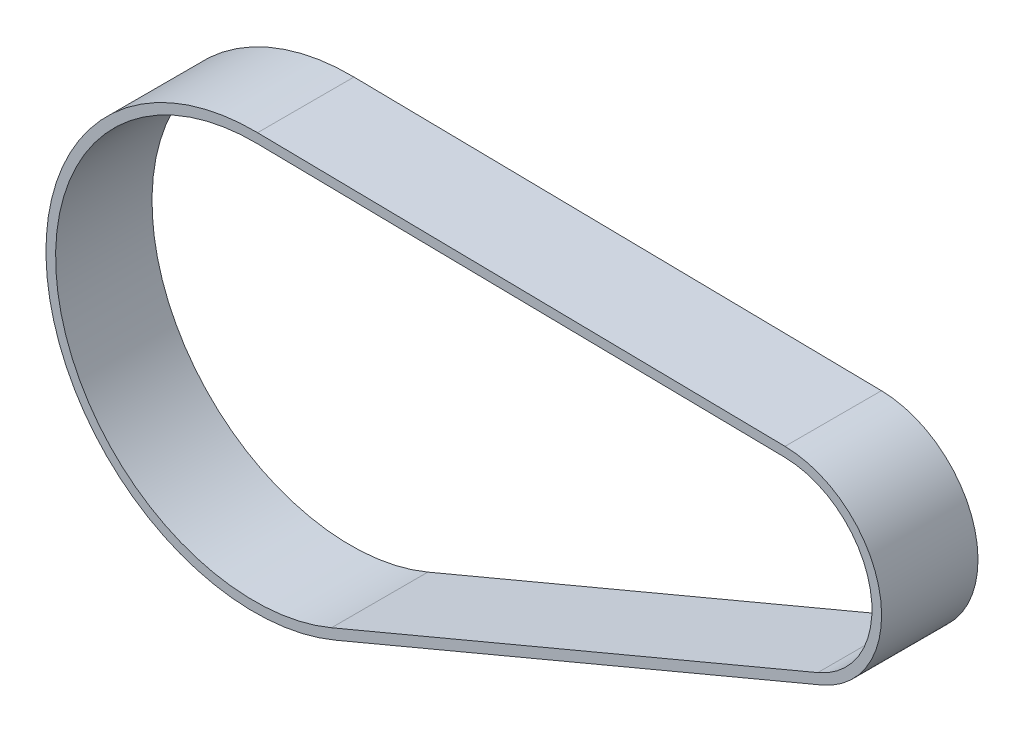
ISO-10303-21;
HEADER;
FILE_DESCRIPTION(('STEP AP214'),'2;1');
FILE_NAME('part.step','',(''),(''),'','','');
FILE_SCHEMA(('AUTOMOTIVE_DESIGN { 1 0 10303 214 1 1 1 1 }'));
ENDSEC;
DATA;
#1=APPLICATION_CONTEXT('core data for automotive mechanical design processes');
#2=APPLICATION_PROTOCOL_DEFINITION('international standard','automotive_design',2000,#1);
#3=PRODUCT_CONTEXT('',#1,'mechanical');
#4=PRODUCT('Part','Part','',(#3));
#5=PRODUCT_RELATED_PRODUCT_CATEGORY('part','',(#4));
#6=PRODUCT_DEFINITION_FORMATION('','',#4);
#7=PRODUCT_DEFINITION_CONTEXT('part definition',#1,'design');
#8=PRODUCT_DEFINITION('design','',#6,#7);
#9=PRODUCT_DEFINITION_SHAPE('','',#8);
#10=(LENGTH_UNIT() NAMED_UNIT(*) SI_UNIT(.MILLI.,.METRE.));
#11=(NAMED_UNIT(*) PLANE_ANGLE_UNIT() SI_UNIT($,.RADIAN.));
#12=(NAMED_UNIT(*) SI_UNIT($,.STERADIAN.) SOLID_ANGLE_UNIT());
#13=UNCERTAINTY_MEASURE_WITH_UNIT(LENGTH_MEASURE(1.E-05),#10,'distance_accuracy_value','');
#14=(GEOMETRIC_REPRESENTATION_CONTEXT(3) GLOBAL_UNCERTAINTY_ASSIGNED_CONTEXT((#13)) GLOBAL_UNIT_ASSIGNED_CONTEXT((#10,
#11,#12)) REPRESENTATION_CONTEXT('',''));
#15=CARTESIAN_POINT('',(0.,0.,0.));
#16=DIRECTION('',(0.,0.,1.));
#17=DIRECTION('',(1.,0.,0.));
#18=AXIS2_PLACEMENT_3D('',#15,#16,#17);
#19=CARTESIAN_POINT('',(-26.1794774684558,56.2138626438231,10.));
#20=DIRECTION('',(0.,0.,1.));
#21=DIRECTION('',(1.,0.,0.));
#22=AXIS2_PLACEMENT_3D('',#19,#20,#21);
#23=PLANE('',#22);
#24=CARTESIAN_POINT('',(-26.1794774684558,56.2138626438231,10.));
#25=DIRECTION('',(0.,0.,1.));
#26=DIRECTION('',(1.,0.,0.));
#27=AXIS2_PLACEMENT_3D('',#24,#25,#26);
#28=CIRCLE('',#27,21.625);
#29=CARTESIAN_POINT('',(-25.8550015384656,77.8364281801062,10.));
#30=VERTEX_POINT('',#29);
#31=CARTESIAN_POINT('',(-17.8029891496812,36.2770858620705,10.));
#32=VERTEX_POINT('',#31);
#33=EDGE_CURVE('E134',#30,#32,#28,.T.);
#34=ORIENTED_EDGE('',*,*,#33,.T.);
#35=DIRECTION('',(0.921931874300702,0.387352060983797,0.));
#36=VECTOR('',#35,1.);
#37=CARTESIAN_POINT('',(-17.8029891496812,36.2770858620705,10.));
#38=LINE('',#37,#36);
#39=CARTESIAN_POINT('',(32.6393486030413,57.4705645062256,10.));
#40=VERTEX_POINT('',#39);
#41=EDGE_CURVE('E137',#32,#40,#38,.T.);
#42=ORIENTED_EDGE('',*,*,#41,.T.);
#43=CARTESIAN_POINT('',(28.6999781428361,66.8466116678637,10.));
#44=DIRECTION('',(0.,0.,1.));
#45=DIRECTION('',(1.,0.,0.));
#46=AXIS2_PLACEMENT_3D('',#43,#44,#45);
#47=CIRCLE('',#46,10.17);
#48=CARTESIAN_POINT('',(28.8525756091021,77.0154667663146,10.));
#49=VERTEX_POINT('',#48);
#50=EDGE_CURVE('E140',#40,#49,#47,.T.);
#51=ORIENTED_EDGE('',*,*,#50,.T.);
#52=DIRECTION('',(-0.999887423643148,0.0150046672827857,0.));
#53=VECTOR('',#52,1.);
#54=CARTESIAN_POINT('',(-25.8550015384656,77.8364281801062,10.));
#55=LINE('',#54,#53);
#56=EDGE_CURVE('E142',#49,#30,#55,.T.);
#57=ORIENTED_EDGE('',*,*,#56,.T.);
#58=EDGE_LOOP('',(#34,#42,#51,#57));
#59=FACE_BOUND('',#58,.T.);
#60=DIRECTION('',(0.921931874300702,0.387352060983797,0.));
#61=VECTOR('',#60,1.);
#62=CARTESIAN_POINT('',(-18.190341210665,37.1990177363711,10.));
#63=LINE('',#62,#61);
#64=CARTESIAN_POINT('',(-18.190341210665,37.1990177363711,10.));
#65=VERTEX_POINT('',#64);
#66=CARTESIAN_POINT('',(32.2519965420575,58.3924963805263,10.));
#67=VERTEX_POINT('',#66);
#68=EDGE_CURVE('E106',#65,#67,#63,.T.);
#69=ORIENTED_EDGE('',*,*,#68,.F.);
#70=CARTESIAN_POINT('',(-26.1794774684558,56.2138626438231,10.));
#71=DIRECTION('',(0.,0.,1.));
#72=DIRECTION('',(1.,0.,0.));
#73=AXIS2_PLACEMENT_3D('',#70,#71,#72);
#74=CIRCLE('',#73,20.625);
#75=CARTESIAN_POINT('',(-25.8700062057483,76.8365407564631,10.));
#76=VERTEX_POINT('',#75);
#77=EDGE_CURVE('E98',#76,#65,#74,.T.);
#78=ORIENTED_EDGE('',*,*,#77,.F.);
#79=DIRECTION('',(-0.999887423643148,0.0150046672827857,0.));
#80=VECTOR('',#79,1.);
#81=CARTESIAN_POINT('',(-25.8700062057483,76.8365407564631,10.));
#82=LINE('',#81,#80);
#83=CARTESIAN_POINT('',(28.8375709418193,76.0155793426714,10.));
#84=VERTEX_POINT('',#83);
#85=EDGE_CURVE('E120',#84,#76,#82,.T.);
#86=ORIENTED_EDGE('',*,*,#85,.F.);
#87=CARTESIAN_POINT('',(28.6999781428361,66.8466116678637,10.));
#88=DIRECTION('',(0.,0.,1.));
#89=DIRECTION('',(1.,0.,0.));
#90=AXIS2_PLACEMENT_3D('',#87,#88,#89);
#91=CIRCLE('',#90,9.16999999999999);
#92=EDGE_CURVE('E118',#67,#84,#91,.T.);
#93=ORIENTED_EDGE('',*,*,#92,.F.);
#94=EDGE_LOOP('',(#69,#78,#86,#93));
#95=FACE_BOUND('',#94,.T.);
#96=ADVANCED_FACE('F33',(#59,#95),#23,.T.);
#97=CARTESIAN_POINT('',(-26.1794774684558,56.2138626438231,0.));
#98=DIRECTION('',(0.,0.,1.));
#99=DIRECTION('',(1.,0.,0.));
#100=AXIS2_PLACEMENT_3D('',#97,#98,#99);
#101=PLANE('',#100);
#102=CARTESIAN_POINT('',(-26.1794774684558,56.2138626438231,0.));
#103=DIRECTION('',(0.,0.,1.));
#104=DIRECTION('',(1.,0.,0.));
#105=AXIS2_PLACEMENT_3D('',#102,#103,#104);
#106=CIRCLE('',#105,21.625);
#107=CARTESIAN_POINT('',(-25.8550015384656,77.8364281801062,0.));
#108=VERTEX_POINT('',#107);
#109=CARTESIAN_POINT('',(-17.8029891496812,36.2770858620705,0.));
#110=VERTEX_POINT('',#109);
#111=EDGE_CURVE('E114',#108,#110,#106,.T.);
#112=ORIENTED_EDGE('',*,*,#111,.F.);
#113=DIRECTION('',(-0.999887423643148,0.0150046672827857,0.));
#114=VECTOR('',#113,1.);
#115=CARTESIAN_POINT('',(-25.8550015384656,77.8364281801062,0.));
#116=LINE('',#115,#114);
#117=CARTESIAN_POINT('',(28.8525756091021,77.0154667663146,0.));
#118=VERTEX_POINT('',#117);
#119=EDGE_CURVE('E138',#118,#108,#116,.T.);
#120=ORIENTED_EDGE('',*,*,#119,.F.);
#121=CARTESIAN_POINT('',(28.6999781428361,66.8466116678637,0.));
#122=DIRECTION('',(0.,0.,1.));
#123=DIRECTION('',(1.,0.,0.));
#124=AXIS2_PLACEMENT_3D('',#121,#122,#123);
#125=CIRCLE('',#124,10.17);
#126=CARTESIAN_POINT('',(32.6393486030413,57.4705645062256,0.));
#127=VERTEX_POINT('',#126);
#128=EDGE_CURVE('E149',#127,#118,#125,.T.);
#129=ORIENTED_EDGE('',*,*,#128,.F.);
#130=DIRECTION('',(0.921931874300702,0.387352060983797,0.));
#131=VECTOR('',#130,1.);
#132=CARTESIAN_POINT('',(-17.8029891496812,36.2770858620705,0.));
#133=LINE('',#132,#131);
#134=EDGE_CURVE('E147',#110,#127,#133,.T.);
#135=ORIENTED_EDGE('',*,*,#134,.F.);
#136=EDGE_LOOP('',(#112,#120,#129,#135));
#137=FACE_BOUND('',#136,.T.);
#138=CARTESIAN_POINT('',(-26.1794774684558,56.2138626438231,0.));
#139=DIRECTION('',(0.,0.,1.));
#140=DIRECTION('',(1.,0.,0.));
#141=AXIS2_PLACEMENT_3D('',#138,#139,#140);
#142=CIRCLE('',#141,20.625);
#143=CARTESIAN_POINT('',(-25.8700062057483,76.8365407564631,0.));
#144=VERTEX_POINT('',#143);
#145=CARTESIAN_POINT('',(-18.190341210665,37.1990177363711,0.));
#146=VERTEX_POINT('',#145);
#147=EDGE_CURVE('E56',#144,#146,#142,.T.);
#148=ORIENTED_EDGE('',*,*,#147,.T.);
#149=DIRECTION('',(0.921931874300702,0.387352060983797,0.));
#150=VECTOR('',#149,1.);
#151=CARTESIAN_POINT('',(-18.190341210665,37.1990177363711,0.));
#152=LINE('',#151,#150);
#153=CARTESIAN_POINT('',(32.2519965420575,58.3924963805263,0.));
#154=VERTEX_POINT('',#153);
#155=EDGE_CURVE('E113',#146,#154,#152,.T.);
#156=ORIENTED_EDGE('',*,*,#155,.T.);
#157=CARTESIAN_POINT('',(28.6999781428361,66.8466116678637,0.));
#158=DIRECTION('',(0.,0.,1.));
#159=DIRECTION('',(1.,0.,0.));
#160=AXIS2_PLACEMENT_3D('',#157,#158,#159);
#161=CIRCLE('',#160,9.16999999999999);
#162=CARTESIAN_POINT('',(28.8375709418193,76.0155793426714,0.));
#163=VERTEX_POINT('',#162);
#164=EDGE_CURVE('E126',#154,#163,#161,.T.);
#165=ORIENTED_EDGE('',*,*,#164,.T.);
#166=DIRECTION('',(-0.999887423643148,0.0150046672827857,0.));
#167=VECTOR('',#166,1.);
#168=CARTESIAN_POINT('',(-25.8700062057483,76.8365407564631,0.));
#169=LINE('',#168,#167);
#170=EDGE_CURVE('E107',#163,#144,#169,.T.);
#171=ORIENTED_EDGE('',*,*,#170,.T.);
#172=EDGE_LOOP('',(#148,#156,#165,#171));
#173=FACE_BOUND('',#172,.T.);
#174=ADVANCED_FACE('F167',(#137,#173),#101,.F.);
#175=CARTESIAN_POINT('',(-26.1794774684558,56.2138626438231,10.));
#176=DIRECTION('',(0.,0.,-1.));
#177=DIRECTION('',(-1.,0.,0.));
#178=AXIS2_PLACEMENT_3D('',#175,#176,#177);
#179=CYLINDRICAL_SURFACE('',#178,21.625);
#180=ORIENTED_EDGE('',*,*,#111,.T.);
#181=DIRECTION('',(0.,0.,-1.));
#182=VECTOR('',#181,1.);
#183=CARTESIAN_POINT('',(-17.8029891496812,36.2770858620705,10.));
#184=LINE('',#183,#182);
#185=EDGE_CURVE('E11',#32,#110,#184,.T.);
#186=ORIENTED_EDGE('',*,*,#185,.F.);
#187=ORIENTED_EDGE('',*,*,#33,.F.);
#188=DIRECTION('',(0.,0.,-1.));
#189=VECTOR('',#188,1.);
#190=CARTESIAN_POINT('',(-25.8550015384656,77.8364281801062,10.));
#191=LINE('',#190,#189);
#192=EDGE_CURVE('E144',#30,#108,#191,.T.);
#193=ORIENTED_EDGE('',*,*,#192,.T.);
#194=EDGE_LOOP('',(#180,#186,#187,#193));
#195=FACE_BOUND('',#194,.T.);
#196=ADVANCED_FACE('F35',(#195),#179,.T.);
#197=CARTESIAN_POINT('',(-17.8029891496812,36.2770858620705,10.));
#198=DIRECTION('',(-0.387352060983797,0.921931874300702,0.));
#199=DIRECTION('',(-0.921931874300702,-0.387352060983797,0.));
#200=AXIS2_PLACEMENT_3D('',#197,#198,#199);
#201=PLANE('',#200);
#202=ORIENTED_EDGE('',*,*,#134,.T.);
#203=DIRECTION('',(0.,0.,-1.));
#204=VECTOR('',#203,1.);
#205=CARTESIAN_POINT('',(32.6393486030413,57.4705645062256,10.));
#206=LINE('',#205,#204);
#207=EDGE_CURVE('E41',#40,#127,#206,.T.);
#208=ORIENTED_EDGE('',*,*,#207,.F.);
#209=ORIENTED_EDGE('',*,*,#41,.F.);
#210=ORIENTED_EDGE('',*,*,#185,.T.);
#211=EDGE_LOOP('',(#202,#208,#209,#210));
#212=FACE_BOUND('',#211,.T.);
#213=ADVANCED_FACE('F177',(#212),#201,.F.);
#214=CARTESIAN_POINT('',(28.6999781428361,66.8466116678637,10.));
#215=DIRECTION('',(0.,0.,-1.));
#216=DIRECTION('',(-1.,0.,0.));
#217=AXIS2_PLACEMENT_3D('',#214,#215,#216);
#218=CYLINDRICAL_SURFACE('',#217,10.17);
#219=ORIENTED_EDGE('',*,*,#128,.T.);
#220=DIRECTION('',(0.,0.,-1.));
#221=VECTOR('',#220,1.);
#222=CARTESIAN_POINT('',(28.8525756091021,77.0154667663146,10.));
#223=LINE('',#222,#221);
#224=EDGE_CURVE('E154',#49,#118,#223,.T.);
#225=ORIENTED_EDGE('',*,*,#224,.F.);
#226=ORIENTED_EDGE('',*,*,#50,.F.);
#227=ORIENTED_EDGE('',*,*,#207,.T.);
#228=EDGE_LOOP('',(#219,#225,#226,#227));
#229=FACE_BOUND('',#228,.T.);
#230=ADVANCED_FACE('F161',(#229),#218,.T.);
#231=CARTESIAN_POINT('',(-25.8550015384656,77.8364281801062,10.));
#232=DIRECTION('',(-0.0150046672827857,-0.999887423643148,0.));
#233=DIRECTION('',(0.999887423643148,-0.0150046672827857,0.));
#234=AXIS2_PLACEMENT_3D('',#231,#232,#233);
#235=PLANE('',#234);
#236=ORIENTED_EDGE('',*,*,#119,.T.);
#237=ORIENTED_EDGE('',*,*,#192,.F.);
#238=ORIENTED_EDGE('',*,*,#56,.F.);
#239=ORIENTED_EDGE('',*,*,#224,.T.);
#240=EDGE_LOOP('',(#236,#237,#238,#239));
#241=FACE_BOUND('',#240,.T.);
#242=ADVANCED_FACE('F171',(#241),#235,.F.);
#243=CARTESIAN_POINT('',(-26.1794774684558,56.2138626438231,10.));
#244=DIRECTION('',(0.,0.,-1.));
#245=DIRECTION('',(-1.,0.,0.));
#246=AXIS2_PLACEMENT_3D('',#243,#244,#245);
#247=CYLINDRICAL_SURFACE('',#246,20.625);
#248=ORIENTED_EDGE('',*,*,#147,.F.);
#249=DIRECTION('',(0.,0.,-1.));
#250=VECTOR('',#249,1.);
#251=CARTESIAN_POINT('',(-25.8700062057483,76.8365407564631,10.));
#252=LINE('',#251,#250);
#253=EDGE_CURVE('E102',#76,#144,#252,.T.);
#254=ORIENTED_EDGE('',*,*,#253,.F.);
#255=ORIENTED_EDGE('',*,*,#77,.T.);
#256=DIRECTION('',(0.,0.,-1.));
#257=VECTOR('',#256,1.);
#258=CARTESIAN_POINT('',(-18.190341210665,37.1990177363711,10.));
#259=LINE('',#258,#257);
#260=EDGE_CURVE('E101',#65,#146,#259,.T.);
#261=ORIENTED_EDGE('',*,*,#260,.T.);
#262=EDGE_LOOP('',(#248,#254,#255,#261));
#263=FACE_BOUND('',#262,.T.);
#264=ADVANCED_FACE('F100',(#263),#247,.F.);
#265=CARTESIAN_POINT('',(-18.190341210665,37.1990177363711,10.));
#266=DIRECTION('',(-0.387352060983797,0.921931874300702,0.));
#267=DIRECTION('',(-0.921931874300702,-0.387352060983797,0.));
#268=AXIS2_PLACEMENT_3D('',#265,#266,#267);
#269=PLANE('',#268);
#270=ORIENTED_EDGE('',*,*,#155,.F.);
#271=ORIENTED_EDGE('',*,*,#260,.F.);
#272=ORIENTED_EDGE('',*,*,#68,.T.);
#273=DIRECTION('',(0.,0.,-1.));
#274=VECTOR('',#273,1.);
#275=CARTESIAN_POINT('',(32.2519965420575,58.3924963805263,10.));
#276=LINE('',#275,#274);
#277=EDGE_CURVE('E115',#67,#154,#276,.T.);
#278=ORIENTED_EDGE('',*,*,#277,.T.);
#279=EDGE_LOOP('',(#270,#271,#272,#278));
#280=FACE_BOUND('',#279,.T.);
#281=ADVANCED_FACE('F110',(#280),#269,.T.);
#282=CARTESIAN_POINT('',(28.6999781428361,66.8466116678637,10.));
#283=DIRECTION('',(0.,0.,-1.));
#284=DIRECTION('',(-1.,0.,0.));
#285=AXIS2_PLACEMENT_3D('',#282,#283,#284);
#286=CYLINDRICAL_SURFACE('',#285,9.16999999999999);
#287=ORIENTED_EDGE('',*,*,#164,.F.);
#288=ORIENTED_EDGE('',*,*,#277,.F.);
#289=ORIENTED_EDGE('',*,*,#92,.T.);
#290=DIRECTION('',(0.,0.,-1.));
#291=VECTOR('',#290,1.);
#292=CARTESIAN_POINT('',(28.8375709418193,76.0155793426714,10.));
#293=LINE('',#292,#291);
#294=EDGE_CURVE('E48',#84,#163,#293,.T.);
#295=ORIENTED_EDGE('',*,*,#294,.T.);
#296=EDGE_LOOP('',(#287,#288,#289,#295));
#297=FACE_BOUND('',#296,.T.);
#298=ADVANCED_FACE('F200',(#297),#286,.F.);
#299=CARTESIAN_POINT('',(-25.8700062057483,76.8365407564631,10.));
#300=DIRECTION('',(-0.0150046672827857,-0.999887423643148,0.));
#301=DIRECTION('',(0.999887423643148,-0.0150046672827857,0.));
#302=AXIS2_PLACEMENT_3D('',#299,#300,#301);
#303=PLANE('',#302);
#304=ORIENTED_EDGE('',*,*,#170,.F.);
#305=ORIENTED_EDGE('',*,*,#294,.F.);
#306=ORIENTED_EDGE('',*,*,#85,.T.);
#307=ORIENTED_EDGE('',*,*,#253,.T.);
#308=EDGE_LOOP('',(#304,#305,#306,#307));
#309=FACE_BOUND('',#308,.T.);
#310=ADVANCED_FACE('F204',(#309),#303,.T.);
#311=CLOSED_SHELL('',(#96,#174,#196,#213,#230,#242,#264,#281,#298,#310));
#312=MANIFOLD_SOLID_BREP('B2',#311);
#313=ADVANCED_BREP_SHAPE_REPRESENTATION('',(#18,#312),#14);
#314=SHAPE_DEFINITION_REPRESENTATION(#9,#313);
ENDSEC;
END-ISO-10303-21;
